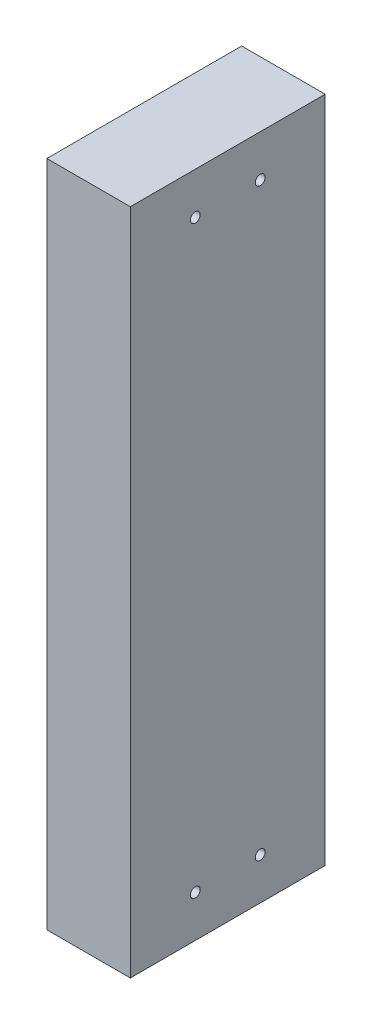
ISO-10303-21;
HEADER;
FILE_DESCRIPTION(('STEP AP214'),'2;1');
FILE_NAME('part.step','',(''),(''),'','','');
FILE_SCHEMA(('AUTOMOTIVE_DESIGN { 1 0 10303 214 1 1 1 1 }'));
ENDSEC;
DATA;
#1=APPLICATION_CONTEXT('core data for automotive mechanical design processes');
#2=APPLICATION_PROTOCOL_DEFINITION('international standard','automotive_design',2000,#1);
#3=PRODUCT_CONTEXT('',#1,'mechanical');
#4=PRODUCT('Part','Part','',(#3));
#5=PRODUCT_RELATED_PRODUCT_CATEGORY('part','',(#4));
#6=PRODUCT_DEFINITION_FORMATION('','',#4);
#7=PRODUCT_DEFINITION_CONTEXT('part definition',#1,'design');
#8=PRODUCT_DEFINITION('design','',#6,#7);
#9=PRODUCT_DEFINITION_SHAPE('','',#8);
#10=(LENGTH_UNIT() NAMED_UNIT(*) SI_UNIT(.MILLI.,.METRE.));
#11=(NAMED_UNIT(*) PLANE_ANGLE_UNIT() SI_UNIT($,.RADIAN.));
#12=(NAMED_UNIT(*) SI_UNIT($,.STERADIAN.) SOLID_ANGLE_UNIT());
#13=UNCERTAINTY_MEASURE_WITH_UNIT(LENGTH_MEASURE(1.E-05),#10,'distance_accuracy_value','');
#14=(GEOMETRIC_REPRESENTATION_CONTEXT(3) GLOBAL_UNCERTAINTY_ASSIGNED_CONTEXT((#13)) GLOBAL_UNIT_ASSIGNED_CONTEXT((#10,
#11,#12)) REPRESENTATION_CONTEXT('',''));
#15=CARTESIAN_POINT('',(0.,0.,0.));
#16=DIRECTION('',(0.,0.,1.));
#17=DIRECTION('',(1.,0.,0.));
#18=AXIS2_PLACEMENT_3D('',#15,#16,#17);
#19=CARTESIAN_POINT('',(0.,304.8,0.));
#20=DIRECTION('',(1.,0.,0.));
#21=DIRECTION('',(0.,0.,-1.));
#22=AXIS2_PLACEMENT_3D('',#19,#20,#21);
#23=PLANE('',#22);
#24=CARTESIAN_POINT('',(0.,285.75,-29.6333333333333));
#25=DIRECTION('',(1.,0.,0.));
#26=DIRECTION('',(0.,0.,-1.));
#27=AXIS2_PLACEMENT_3D('',#24,#25,#26);
#28=CIRCLE('',#27,2.24789999999999);
#29=CARTESIAN_POINT('',(0.,285.75,-31.8812333333333));
#30=VERTEX_POINT('',#29);
#31=EDGE_CURVE('E119',#30,#30,#28,.T.);
#32=ORIENTED_EDGE('',*,*,#31,.T.);
#33=EDGE_LOOP('',(#32));
#34=FACE_BOUND('',#33,.T.);
#35=CARTESIAN_POINT('',(0.,19.05,-29.6333333333333));
#36=DIRECTION('',(1.,0.,0.));
#37=DIRECTION('',(0.,0.,-1.));
#38=AXIS2_PLACEMENT_3D('',#35,#36,#37);
#39=CIRCLE('',#38,2.2479);
#40=CARTESIAN_POINT('',(0.,19.05,-31.8812333333333));
#41=VERTEX_POINT('',#40);
#42=EDGE_CURVE('E125',#41,#41,#39,.T.);
#43=ORIENTED_EDGE('',*,*,#42,.T.);
#44=EDGE_LOOP('',(#43));
#45=FACE_BOUND('',#44,.T.);
#46=CARTESIAN_POINT('',(0.,19.05,-59.2666666666667));
#47=DIRECTION('',(1.,0.,0.));
#48=DIRECTION('',(0.,0.,-1.));
#49=AXIS2_PLACEMENT_3D('',#46,#47,#48);
#50=CIRCLE('',#49,2.2479);
#51=CARTESIAN_POINT('',(0.,19.05,-61.5145666666667));
#52=VERTEX_POINT('',#51);
#53=EDGE_CURVE('E113',#52,#52,#50,.T.);
#54=ORIENTED_EDGE('',*,*,#53,.T.);
#55=EDGE_LOOP('',(#54));
#56=FACE_BOUND('',#55,.T.);
#57=CARTESIAN_POINT('',(0.,285.75,-59.2666666666667));
#58=DIRECTION('',(1.,0.,0.));
#59=DIRECTION('',(0.,0.,-1.));
#60=AXIS2_PLACEMENT_3D('',#57,#58,#59);
#61=CIRCLE('',#60,2.24789999999999);
#62=CARTESIAN_POINT('',(0.,285.75,-61.5145666666666));
#63=VERTEX_POINT('',#62);
#64=EDGE_CURVE('E99',#63,#63,#61,.T.);
#65=ORIENTED_EDGE('',*,*,#64,.T.);
#66=EDGE_LOOP('',(#65));
#67=FACE_BOUND('',#66,.T.);
#68=DIRECTION('',(0.,0.,1.));
#69=VECTOR('',#68,1.);
#70=CARTESIAN_POINT('',(0.,0.,0.));
#71=LINE('',#70,#69);
#72=CARTESIAN_POINT('',(0.,0.,-88.9));
#73=VERTEX_POINT('',#72);
#74=CARTESIAN_POINT('',(0.,0.,0.));
#75=VERTEX_POINT('',#74);
#76=EDGE_CURVE('E96',#73,#75,#71,.T.);
#77=ORIENTED_EDGE('',*,*,#76,.T.);
#78=DIRECTION('',(0.,-1.,0.));
#79=VECTOR('',#78,1.);
#80=CARTESIAN_POINT('',(0.,304.8,0.));
#81=LINE('',#80,#79);
#82=CARTESIAN_POINT('',(0.,304.8,0.));
#83=VERTEX_POINT('',#82);
#84=EDGE_CURVE('E11',#83,#75,#81,.T.);
#85=ORIENTED_EDGE('',*,*,#84,.F.);
#86=DIRECTION('',(0.,0.,1.));
#87=VECTOR('',#86,1.);
#88=CARTESIAN_POINT('',(0.,304.8,0.));
#89=LINE('',#88,#87);
#90=CARTESIAN_POINT('',(0.,304.8,-88.9));
#91=VERTEX_POINT('',#90);
#92=EDGE_CURVE('E84',#91,#83,#89,.T.);
#93=ORIENTED_EDGE('',*,*,#92,.F.);
#94=DIRECTION('',(0.,-1.,0.));
#95=VECTOR('',#94,1.);
#96=CARTESIAN_POINT('',(0.,304.8,-88.9));
#97=LINE('',#96,#95);
#98=EDGE_CURVE('E92',#91,#73,#97,.T.);
#99=ORIENTED_EDGE('',*,*,#98,.T.);
#100=EDGE_LOOP('',(#77,#85,#93,#99));
#101=FACE_BOUND('',#100,.T.);
#102=ADVANCED_FACE('F33',(#34,#45,#56,#67,#101),#23,.F.);
#103=CARTESIAN_POINT('',(0.,304.8,0.));
#104=DIRECTION('',(0.,0.,-1.));
#105=DIRECTION('',(-1.,0.,0.));
#106=AXIS2_PLACEMENT_3D('',#103,#104,#105);
#107=PLANE('',#106);
#108=DIRECTION('',(1.,0.,0.));
#109=VECTOR('',#108,1.);
#110=CARTESIAN_POINT('',(0.,0.,0.));
#111=LINE('',#110,#109);
#112=CARTESIAN_POINT('',(38.1,0.,0.));
#113=VERTEX_POINT('',#112);
#114=EDGE_CURVE('E88',#75,#113,#111,.T.);
#115=ORIENTED_EDGE('',*,*,#114,.T.);
#116=DIRECTION('',(0.,-1.,0.));
#117=VECTOR('',#116,1.);
#118=CARTESIAN_POINT('',(38.1,304.8,0.));
#119=LINE('',#118,#117);
#120=CARTESIAN_POINT('',(38.1,304.8,0.));
#121=VERTEX_POINT('',#120);
#122=EDGE_CURVE('E41',#121,#113,#119,.T.);
#123=ORIENTED_EDGE('',*,*,#122,.F.);
#124=DIRECTION('',(1.,0.,0.));
#125=VECTOR('',#124,1.);
#126=CARTESIAN_POINT('',(0.,304.8,0.));
#127=LINE('',#126,#125);
#128=EDGE_CURVE('E79',#83,#121,#127,.T.);
#129=ORIENTED_EDGE('',*,*,#128,.F.);
#130=ORIENTED_EDGE('',*,*,#84,.T.);
#131=EDGE_LOOP('',(#115,#123,#129,#130));
#132=FACE_BOUND('',#131,.T.);
#133=ADVANCED_FACE('F87',(#132),#107,.F.);
#134=CARTESIAN_POINT('',(38.1,304.8,0.));
#135=DIRECTION('',(-1.,0.,0.));
#136=DIRECTION('',(0.,0.,1.));
#137=AXIS2_PLACEMENT_3D('',#134,#135,#136);
#138=PLANE('',#137);
#139=CARTESIAN_POINT('',(38.1,285.75,-29.6333333333333));
#140=DIRECTION('',(1.,0.,0.));
#141=DIRECTION('',(0.,0.,-1.));
#142=AXIS2_PLACEMENT_3D('',#139,#140,#141);
#143=CIRCLE('',#142,2.24789999999999);
#144=CARTESIAN_POINT('',(38.1,285.75,-31.8812333333333));
#145=VERTEX_POINT('',#144);
#146=EDGE_CURVE('E116',#145,#145,#143,.T.);
#147=ORIENTED_EDGE('',*,*,#146,.F.);
#148=EDGE_LOOP('',(#147));
#149=FACE_BOUND('',#148,.T.);
#150=CARTESIAN_POINT('',(38.1,19.05,-29.6333333333333));
#151=DIRECTION('',(1.,0.,0.));
#152=DIRECTION('',(0.,0.,-1.));
#153=AXIS2_PLACEMENT_3D('',#150,#151,#152);
#154=CIRCLE('',#153,2.2479);
#155=CARTESIAN_POINT('',(38.1,19.05,-31.8812333333333));
#156=VERTEX_POINT('',#155);
#157=EDGE_CURVE('E122',#156,#156,#154,.T.);
#158=ORIENTED_EDGE('',*,*,#157,.F.);
#159=EDGE_LOOP('',(#158));
#160=FACE_BOUND('',#159,.T.);
#161=CARTESIAN_POINT('',(38.1,19.05,-59.2666666666667));
#162=DIRECTION('',(1.,0.,0.));
#163=DIRECTION('',(0.,0.,-1.));
#164=AXIS2_PLACEMENT_3D('',#161,#162,#163);
#165=CIRCLE('',#164,2.2479);
#166=CARTESIAN_POINT('',(38.1,19.05,-61.5145666666667));
#167=VERTEX_POINT('',#166);
#168=EDGE_CURVE('E128',#167,#167,#165,.T.);
#169=ORIENTED_EDGE('',*,*,#168,.F.);
#170=EDGE_LOOP('',(#169));
#171=FACE_BOUND('',#170,.T.);
#172=CARTESIAN_POINT('',(38.1,285.75,-59.2666666666667));
#173=DIRECTION('',(1.,0.,0.));
#174=DIRECTION('',(0.,0.,-1.));
#175=AXIS2_PLACEMENT_3D('',#172,#173,#174);
#176=CIRCLE('',#175,2.24789999999999);
#177=CARTESIAN_POINT('',(38.1,285.75,-61.5145666666666));
#178=VERTEX_POINT('',#177);
#179=EDGE_CURVE('E110',#178,#178,#176,.T.);
#180=ORIENTED_EDGE('',*,*,#179,.F.);
#181=EDGE_LOOP('',(#180));
#182=FACE_BOUND('',#181,.T.);
#183=DIRECTION('',(0.,0.,-1.));
#184=VECTOR('',#183,1.);
#185=CARTESIAN_POINT('',(38.1,0.,0.));
#186=LINE('',#185,#184);
#187=CARTESIAN_POINT('',(38.1,0.,-88.9));
#188=VERTEX_POINT('',#187);
#189=EDGE_CURVE('E66',#113,#188,#186,.T.);
#190=ORIENTED_EDGE('',*,*,#189,.T.);
#191=DIRECTION('',(0.,-1.,0.));
#192=VECTOR('',#191,1.);
#193=CARTESIAN_POINT('',(38.1,304.8,-88.9));
#194=LINE('',#193,#192);
#195=CARTESIAN_POINT('',(38.1,304.8,-88.9));
#196=VERTEX_POINT('',#195);
#197=EDGE_CURVE('E89',#196,#188,#194,.T.);
#198=ORIENTED_EDGE('',*,*,#197,.F.);
#199=DIRECTION('',(0.,0.,-1.));
#200=VECTOR('',#199,1.);
#201=CARTESIAN_POINT('',(38.1,304.8,0.));
#202=LINE('',#201,#200);
#203=EDGE_CURVE('E82',#121,#196,#202,.T.);
#204=ORIENTED_EDGE('',*,*,#203,.F.);
#205=ORIENTED_EDGE('',*,*,#122,.T.);
#206=EDGE_LOOP('',(#190,#198,#204,#205));
#207=FACE_BOUND('',#206,.T.);
#208=ADVANCED_FACE('F90',(#149,#160,#171,#182,#207),#138,.F.);
#209=CARTESIAN_POINT('',(0.,304.8,-88.9));
#210=DIRECTION('',(0.,0.,1.));
#211=DIRECTION('',(1.,0.,0.));
#212=AXIS2_PLACEMENT_3D('',#209,#210,#211);
#213=PLANE('',#212);
#214=DIRECTION('',(-1.,0.,0.));
#215=VECTOR('',#214,1.);
#216=CARTESIAN_POINT('',(0.,0.,-88.9));
#217=LINE('',#216,#215);
#218=EDGE_CURVE('E72',#188,#73,#217,.T.);
#219=ORIENTED_EDGE('',*,*,#218,.T.);
#220=ORIENTED_EDGE('',*,*,#98,.F.);
#221=DIRECTION('',(-1.,0.,0.));
#222=VECTOR('',#221,1.);
#223=CARTESIAN_POINT('',(0.,304.8,-88.9));
#224=LINE('',#223,#222);
#225=EDGE_CURVE('E49',#196,#91,#224,.T.);
#226=ORIENTED_EDGE('',*,*,#225,.F.);
#227=ORIENTED_EDGE('',*,*,#197,.T.);
#228=EDGE_LOOP('',(#219,#220,#226,#227));
#229=FACE_BOUND('',#228,.T.);
#230=ADVANCED_FACE('F104',(#229),#213,.F.);
#231=CARTESIAN_POINT('',(0.,304.8,0.));
#232=DIRECTION('',(0.,-1.,0.));
#233=DIRECTION('',(0.,0.,-1.));
#234=AXIS2_PLACEMENT_3D('',#231,#232,#233);
#235=PLANE('',#234);
#236=ORIENTED_EDGE('',*,*,#92,.T.);
#237=ORIENTED_EDGE('',*,*,#128,.T.);
#238=ORIENTED_EDGE('',*,*,#203,.T.);
#239=ORIENTED_EDGE('',*,*,#225,.T.);
#240=EDGE_LOOP('',(#236,#237,#238,#239));
#241=FACE_BOUND('',#240,.T.);
#242=ADVANCED_FACE('F80',(#241),#235,.F.);
#243=CARTESIAN_POINT('',(0.,0.,0.));
#244=DIRECTION('',(0.,-1.,0.));
#245=DIRECTION('',(0.,0.,-1.));
#246=AXIS2_PLACEMENT_3D('',#243,#244,#245);
#247=PLANE('',#246);
#248=ORIENTED_EDGE('',*,*,#76,.F.);
#249=ORIENTED_EDGE('',*,*,#218,.F.);
#250=ORIENTED_EDGE('',*,*,#189,.F.);
#251=ORIENTED_EDGE('',*,*,#114,.F.);
#252=EDGE_LOOP('',(#248,#249,#250,#251));
#253=FACE_BOUND('',#252,.T.);
#254=ADVANCED_FACE('F107',(#253),#247,.T.);
#255=CARTESIAN_POINT('',(0.,285.75,-59.2666666666667));
#256=DIRECTION('',(1.,0.,0.));
#257=DIRECTION('',(0.,0.,-1.));
#258=AXIS2_PLACEMENT_3D('',#255,#256,#257);
#259=CYLINDRICAL_SURFACE('',#258,2.24789999999999);
#260=CARTESIAN_POINT('',(0.,285.75,-61.5145666666666));
#261=CARTESIAN_POINT('',(0.396875,285.75,-61.5145666666666));
#262=CARTESIAN_POINT('',(0.79375,285.75,-61.5145666666666));
#263=CARTESIAN_POINT('',(1.5875,285.75,-61.5145666666666));
#264=CARTESIAN_POINT('',(1.984375,285.75,-61.5145666666666));
#265=CARTESIAN_POINT('',(2.778125,285.75,-61.5145666666666));
#266=CARTESIAN_POINT('',(3.175,285.75,-61.5145666666666));
#267=CARTESIAN_POINT('',(3.96875,285.75,-61.5145666666666));
#268=CARTESIAN_POINT('',(4.365625,285.75,-61.5145666666666));
#269=CARTESIAN_POINT('',(5.159375,285.75,-61.5145666666666));
#270=CARTESIAN_POINT('',(5.55625,285.75,-61.5145666666666));
#271=CARTESIAN_POINT('',(6.35,285.75,-61.5145666666666));
#272=CARTESIAN_POINT('',(6.746875,285.75,-61.5145666666666));
#273=CARTESIAN_POINT('',(7.540625,285.75,-61.5145666666666));
#274=CARTESIAN_POINT('',(7.9375,285.75,-61.5145666666666));
#275=CARTESIAN_POINT('',(8.73125,285.75,-61.5145666666666));
#276=CARTESIAN_POINT('',(9.128125,285.75,-61.5145666666666));
#277=CARTESIAN_POINT('',(9.921875,285.75,-61.5145666666666));
#278=CARTESIAN_POINT('',(10.31875,285.75,-61.5145666666666));
#279=CARTESIAN_POINT('',(11.1125,285.75,-61.5145666666666));
#280=CARTESIAN_POINT('',(11.509375,285.75,-61.5145666666666));
#281=CARTESIAN_POINT('',(12.303125,285.75,-61.5145666666666));
#282=CARTESIAN_POINT('',(12.7,285.75,-61.5145666666666));
#283=CARTESIAN_POINT('',(13.49375,285.75,-61.5145666666666));
#284=CARTESIAN_POINT('',(13.890625,285.75,-61.5145666666666));
#285=CARTESIAN_POINT('',(14.684375,285.75,-61.5145666666666));
#286=CARTESIAN_POINT('',(15.08125,285.75,-61.5145666666666));
#287=CARTESIAN_POINT('',(15.875,285.75,-61.5145666666666));
#288=CARTESIAN_POINT('',(16.271875,285.75,-61.5145666666666));
#289=CARTESIAN_POINT('',(17.065625,285.75,-61.5145666666666));
#290=CARTESIAN_POINT('',(17.4625,285.75,-61.5145666666666));
#291=CARTESIAN_POINT('',(18.25625,285.75,-61.5145666666666));
#292=CARTESIAN_POINT('',(18.653125,285.75,-61.5145666666666));
#293=CARTESIAN_POINT('',(19.446875,285.75,-61.5145666666666));
#294=CARTESIAN_POINT('',(19.84375,285.75,-61.5145666666666));
#295=CARTESIAN_POINT('',(20.6375,285.75,-61.5145666666666));
#296=CARTESIAN_POINT('',(21.034375,285.75,-61.5145666666666));
#297=CARTESIAN_POINT('',(21.828125,285.75,-61.5145666666666));
#298=CARTESIAN_POINT('',(22.225,285.75,-61.5145666666666));
#299=CARTESIAN_POINT('',(23.01875,285.75,-61.5145666666666));
#300=CARTESIAN_POINT('',(23.415625,285.75,-61.5145666666666));
#301=CARTESIAN_POINT('',(24.209375,285.75,-61.5145666666666));
#302=CARTESIAN_POINT('',(24.60625,285.75,-61.5145666666666));
#303=CARTESIAN_POINT('',(25.4,285.75,-61.5145666666666));
#304=CARTESIAN_POINT('',(25.796875,285.75,-61.5145666666666));
#305=CARTESIAN_POINT('',(26.590625,285.75,-61.5145666666666));
#306=CARTESIAN_POINT('',(26.9875,285.75,-61.5145666666666));
#307=CARTESIAN_POINT('',(27.78125,285.75,-61.5145666666666));
#308=CARTESIAN_POINT('',(28.178125,285.75,-61.5145666666666));
#309=CARTESIAN_POINT('',(28.971875,285.75,-61.5145666666666));
#310=CARTESIAN_POINT('',(29.36875,285.75,-61.5145666666666));
#311=CARTESIAN_POINT('',(30.1625,285.75,-61.5145666666666));
#312=CARTESIAN_POINT('',(30.559375,285.75,-61.5145666666666));
#313=CARTESIAN_POINT('',(31.353125,285.75,-61.5145666666666));
#314=CARTESIAN_POINT('',(31.75,285.75,-61.5145666666666));
#315=CARTESIAN_POINT('',(32.54375,285.75,-61.5145666666666));
#316=CARTESIAN_POINT('',(32.940625,285.75,-61.5145666666666));
#317=CARTESIAN_POINT('',(33.734375,285.75,-61.5145666666666));
#318=CARTESIAN_POINT('',(34.13125,285.75,-61.5145666666666));
#319=CARTESIAN_POINT('',(34.925,285.75,-61.5145666666666));
#320=CARTESIAN_POINT('',(35.321875,285.75,-61.5145666666666));
#321=CARTESIAN_POINT('',(36.115625,285.75,-61.5145666666666));
#322=CARTESIAN_POINT('',(36.5125,285.75,-61.5145666666666));
#323=CARTESIAN_POINT('',(37.30625,285.75,-61.5145666666666));
#324=CARTESIAN_POINT('',(37.703125,285.75,-61.5145666666666));
#325=CARTESIAN_POINT('',(38.1,285.75,-61.5145666666666));
#326=B_SPLINE_CURVE_WITH_KNOTS('',3,(#260,#261,#262,#263,#264,#265,#266,#267,#268,#269,#270,
#271,#272,#273,#274,#275,#276,#277,#278,#279,#280,#281,#282,#283,#284,#285,#286,#287,#288,#289,
#290,#291,#292,#293,#294,#295,#296,#297,#298,#299,#300,#301,#302,#303,#304,#305,#306,#307,#308,
#309,#310,#311,#312,#313,#314,#315,#316,#317,#318,#319,#320,#321,#322,#323,#324,#325),
.UNSPECIFIED.,.F.,.F.,(4,2,2,2,2,2,2,2,2,2,2,2,2,2,2,2,2,2,2,2,2,2,2,2,2,2,2,2,2,2,2,2,4),(0.,
1.190625,2.38125,3.571875,4.7625,5.953125,7.14375,8.334375,9.525,10.715625,11.90625,13.096875,
14.2875,15.478125,16.66875,17.859375,19.05,20.240625,21.43125,22.621875,23.8125,25.003125,
26.19375,27.384375,28.575,29.765625,30.95625,32.146875,33.3375,34.528125,35.71875,36.909375,
38.1),.UNSPECIFIED.);
#327=EDGE_CURVE('BSEAM140',#63,#178,#326,.T.);
#328=ORIENTED_EDGE('',*,*,#64,.F.);
#329=ORIENTED_EDGE('',*,*,#179,.T.);
#330=ORIENTED_EDGE('',*,*,#327,.T.);
#331=ORIENTED_EDGE('',*,*,#327,.F.);
#332=EDGE_LOOP('',(#328,#330,#329,#331));
#333=FACE_BOUND('',#332,.T.);
#334=ADVANCED_FACE('F140',(#333),#259,.F.);
#335=CARTESIAN_POINT('',(0.,19.05,-59.2666666666667));
#336=DIRECTION('',(1.,0.,0.));
#337=DIRECTION('',(0.,0.,-1.));
#338=AXIS2_PLACEMENT_3D('',#335,#336,#337);
#339=CYLINDRICAL_SURFACE('',#338,2.2479);
#340=CARTESIAN_POINT('',(0.,19.05,-61.5145666666667));
#341=CARTESIAN_POINT('',(0.396875,19.05,-61.5145666666667));
#342=CARTESIAN_POINT('',(0.79375,19.05,-61.5145666666667));
#343=CARTESIAN_POINT('',(1.5875,19.05,-61.5145666666667));
#344=CARTESIAN_POINT('',(1.984375,19.05,-61.5145666666667));
#345=CARTESIAN_POINT('',(2.778125,19.05,-61.5145666666667));
#346=CARTESIAN_POINT('',(3.175,19.05,-61.5145666666667));
#347=CARTESIAN_POINT('',(3.96875,19.05,-61.5145666666667));
#348=CARTESIAN_POINT('',(4.365625,19.05,-61.5145666666667));
#349=CARTESIAN_POINT('',(5.159375,19.05,-61.5145666666667));
#350=CARTESIAN_POINT('',(5.55625,19.05,-61.5145666666667));
#351=CARTESIAN_POINT('',(6.35,19.05,-61.5145666666667));
#352=CARTESIAN_POINT('',(6.746875,19.05,-61.5145666666667));
#353=CARTESIAN_POINT('',(7.540625,19.05,-61.5145666666667));
#354=CARTESIAN_POINT('',(7.9375,19.05,-61.5145666666667));
#355=CARTESIAN_POINT('',(8.73125,19.05,-61.5145666666667));
#356=CARTESIAN_POINT('',(9.128125,19.05,-61.5145666666667));
#357=CARTESIAN_POINT('',(9.921875,19.05,-61.5145666666667));
#358=CARTESIAN_POINT('',(10.31875,19.05,-61.5145666666667));
#359=CARTESIAN_POINT('',(11.1125,19.05,-61.5145666666667));
#360=CARTESIAN_POINT('',(11.509375,19.05,-61.5145666666667));
#361=CARTESIAN_POINT('',(12.303125,19.05,-61.5145666666667));
#362=CARTESIAN_POINT('',(12.7,19.05,-61.5145666666667));
#363=CARTESIAN_POINT('',(13.49375,19.05,-61.5145666666667));
#364=CARTESIAN_POINT('',(13.890625,19.05,-61.5145666666667));
#365=CARTESIAN_POINT('',(14.684375,19.05,-61.5145666666667));
#366=CARTESIAN_POINT('',(15.08125,19.05,-61.5145666666667));
#367=CARTESIAN_POINT('',(15.875,19.05,-61.5145666666667));
#368=CARTESIAN_POINT('',(16.271875,19.05,-61.5145666666667));
#369=CARTESIAN_POINT('',(17.065625,19.05,-61.5145666666667));
#370=CARTESIAN_POINT('',(17.4625,19.05,-61.5145666666667));
#371=CARTESIAN_POINT('',(18.25625,19.05,-61.5145666666667));
#372=CARTESIAN_POINT('',(18.653125,19.05,-61.5145666666667));
#373=CARTESIAN_POINT('',(19.446875,19.05,-61.5145666666667));
#374=CARTESIAN_POINT('',(19.84375,19.05,-61.5145666666667));
#375=CARTESIAN_POINT('',(20.6375,19.05,-61.5145666666667));
#376=CARTESIAN_POINT('',(21.034375,19.05,-61.5145666666667));
#377=CARTESIAN_POINT('',(21.828125,19.05,-61.5145666666667));
#378=CARTESIAN_POINT('',(22.225,19.05,-61.5145666666667));
#379=CARTESIAN_POINT('',(23.01875,19.05,-61.5145666666667));
#380=CARTESIAN_POINT('',(23.415625,19.05,-61.5145666666667));
#381=CARTESIAN_POINT('',(24.209375,19.05,-61.5145666666667));
#382=CARTESIAN_POINT('',(24.60625,19.05,-61.5145666666667));
#383=CARTESIAN_POINT('',(25.4,19.05,-61.5145666666667));
#384=CARTESIAN_POINT('',(25.796875,19.05,-61.5145666666667));
#385=CARTESIAN_POINT('',(26.590625,19.05,-61.5145666666667));
#386=CARTESIAN_POINT('',(26.9875,19.05,-61.5145666666667));
#387=CARTESIAN_POINT('',(27.78125,19.05,-61.5145666666667));
#388=CARTESIAN_POINT('',(28.178125,19.05,-61.5145666666667));
#389=CARTESIAN_POINT('',(28.971875,19.05,-61.5145666666667));
#390=CARTESIAN_POINT('',(29.36875,19.05,-61.5145666666667));
#391=CARTESIAN_POINT('',(30.1625,19.05,-61.5145666666667));
#392=CARTESIAN_POINT('',(30.559375,19.05,-61.5145666666667));
#393=CARTESIAN_POINT('',(31.353125,19.05,-61.5145666666667));
#394=CARTESIAN_POINT('',(31.75,19.05,-61.5145666666667));
#395=CARTESIAN_POINT('',(32.54375,19.05,-61.5145666666667));
#396=CARTESIAN_POINT('',(32.940625,19.05,-61.5145666666667));
#397=CARTESIAN_POINT('',(33.734375,19.05,-61.5145666666667));
#398=CARTESIAN_POINT('',(34.13125,19.05,-61.5145666666667));
#399=CARTESIAN_POINT('',(34.925,19.05,-61.5145666666667));
#400=CARTESIAN_POINT('',(35.321875,19.05,-61.5145666666667));
#401=CARTESIAN_POINT('',(36.115625,19.05,-61.5145666666667));
#402=CARTESIAN_POINT('',(36.5125,19.05,-61.5145666666667));
#403=CARTESIAN_POINT('',(37.30625,19.05,-61.5145666666667));
#404=CARTESIAN_POINT('',(37.703125,19.05,-61.5145666666667));
#405=CARTESIAN_POINT('',(38.1,19.05,-61.5145666666667));
#406=B_SPLINE_CURVE_WITH_KNOTS('',3,(#340,#341,#342,#343,#344,#345,#346,#347,#348,#349,#350,
#351,#352,#353,#354,#355,#356,#357,#358,#359,#360,#361,#362,#363,#364,#365,#366,#367,#368,#369,
#370,#371,#372,#373,#374,#375,#376,#377,#378,#379,#380,#381,#382,#383,#384,#385,#386,#387,#388,
#389,#390,#391,#392,#393,#394,#395,#396,#397,#398,#399,#400,#401,#402,#403,#404,#405),
.UNSPECIFIED.,.F.,.F.,(4,2,2,2,2,2,2,2,2,2,2,2,2,2,2,2,2,2,2,2,2,2,2,2,2,2,2,2,2,2,2,2,4),(0.,
1.190625,2.38125,3.571875,4.7625,5.953125,7.14375,8.334375,9.525,10.715625,11.90625,13.096875,
14.2875,15.478125,16.66875,17.859375,19.05,20.240625,21.43125,22.621875,23.8125,25.003125,
26.19375,27.384375,28.575,29.765625,30.95625,32.146875,33.3375,34.528125,35.71875,36.909375,
38.1),.UNSPECIFIED.);
#407=EDGE_CURVE('BSEAM136',#52,#167,#406,.T.);
#408=ORIENTED_EDGE('',*,*,#53,.F.);
#409=ORIENTED_EDGE('',*,*,#168,.T.);
#410=ORIENTED_EDGE('',*,*,#407,.T.);
#411=ORIENTED_EDGE('',*,*,#407,.F.);
#412=EDGE_LOOP('',(#408,#410,#409,#411));
#413=FACE_BOUND('',#412,.T.);
#414=ADVANCED_FACE('F136',(#413),#339,.F.);
#415=CARTESIAN_POINT('',(0.,19.05,-29.6333333333333));
#416=DIRECTION('',(1.,0.,0.));
#417=DIRECTION('',(0.,0.,-1.));
#418=AXIS2_PLACEMENT_3D('',#415,#416,#417);
#419=CYLINDRICAL_SURFACE('',#418,2.2479);
#420=CARTESIAN_POINT('',(0.,19.05,-31.8812333333333));
#421=CARTESIAN_POINT('',(0.396875,19.05,-31.8812333333333));
#422=CARTESIAN_POINT('',(0.79375,19.05,-31.8812333333333));
#423=CARTESIAN_POINT('',(1.5875,19.05,-31.8812333333333));
#424=CARTESIAN_POINT('',(1.984375,19.05,-31.8812333333333));
#425=CARTESIAN_POINT('',(2.778125,19.05,-31.8812333333333));
#426=CARTESIAN_POINT('',(3.175,19.05,-31.8812333333333));
#427=CARTESIAN_POINT('',(3.96875,19.05,-31.8812333333333));
#428=CARTESIAN_POINT('',(4.365625,19.05,-31.8812333333333));
#429=CARTESIAN_POINT('',(5.159375,19.05,-31.8812333333333));
#430=CARTESIAN_POINT('',(5.55625,19.05,-31.8812333333333));
#431=CARTESIAN_POINT('',(6.35,19.05,-31.8812333333333));
#432=CARTESIAN_POINT('',(6.746875,19.05,-31.8812333333333));
#433=CARTESIAN_POINT('',(7.540625,19.05,-31.8812333333333));
#434=CARTESIAN_POINT('',(7.9375,19.05,-31.8812333333333));
#435=CARTESIAN_POINT('',(8.73125,19.05,-31.8812333333333));
#436=CARTESIAN_POINT('',(9.128125,19.05,-31.8812333333333));
#437=CARTESIAN_POINT('',(9.921875,19.05,-31.8812333333333));
#438=CARTESIAN_POINT('',(10.31875,19.05,-31.8812333333333));
#439=CARTESIAN_POINT('',(11.1125,19.05,-31.8812333333333));
#440=CARTESIAN_POINT('',(11.509375,19.05,-31.8812333333333));
#441=CARTESIAN_POINT('',(12.303125,19.05,-31.8812333333333));
#442=CARTESIAN_POINT('',(12.7,19.05,-31.8812333333333));
#443=CARTESIAN_POINT('',(13.49375,19.05,-31.8812333333333));
#444=CARTESIAN_POINT('',(13.890625,19.05,-31.8812333333333));
#445=CARTESIAN_POINT('',(14.684375,19.05,-31.8812333333333));
#446=CARTESIAN_POINT('',(15.08125,19.05,-31.8812333333333));
#447=CARTESIAN_POINT('',(15.875,19.05,-31.8812333333333));
#448=CARTESIAN_POINT('',(16.271875,19.05,-31.8812333333333));
#449=CARTESIAN_POINT('',(17.065625,19.05,-31.8812333333333));
#450=CARTESIAN_POINT('',(17.4625,19.05,-31.8812333333333));
#451=CARTESIAN_POINT('',(18.25625,19.05,-31.8812333333333));
#452=CARTESIAN_POINT('',(18.653125,19.05,-31.8812333333333));
#453=CARTESIAN_POINT('',(19.446875,19.05,-31.8812333333333));
#454=CARTESIAN_POINT('',(19.84375,19.05,-31.8812333333333));
#455=CARTESIAN_POINT('',(20.6375,19.05,-31.8812333333333));
#456=CARTESIAN_POINT('',(21.034375,19.05,-31.8812333333333));
#457=CARTESIAN_POINT('',(21.828125,19.05,-31.8812333333333));
#458=CARTESIAN_POINT('',(22.225,19.05,-31.8812333333333));
#459=CARTESIAN_POINT('',(23.01875,19.05,-31.8812333333333));
#460=CARTESIAN_POINT('',(23.415625,19.05,-31.8812333333333));
#461=CARTESIAN_POINT('',(24.209375,19.05,-31.8812333333333));
#462=CARTESIAN_POINT('',(24.60625,19.05,-31.8812333333333));
#463=CARTESIAN_POINT('',(25.4,19.05,-31.8812333333333));
#464=CARTESIAN_POINT('',(25.796875,19.05,-31.8812333333333));
#465=CARTESIAN_POINT('',(26.590625,19.05,-31.8812333333333));
#466=CARTESIAN_POINT('',(26.9875,19.05,-31.8812333333333));
#467=CARTESIAN_POINT('',(27.78125,19.05,-31.8812333333333));
#468=CARTESIAN_POINT('',(28.178125,19.05,-31.8812333333333));
#469=CARTESIAN_POINT('',(28.971875,19.05,-31.8812333333333));
#470=CARTESIAN_POINT('',(29.36875,19.05,-31.8812333333333));
#471=CARTESIAN_POINT('',(30.1625,19.05,-31.8812333333333));
#472=CARTESIAN_POINT('',(30.559375,19.05,-31.8812333333333));
#473=CARTESIAN_POINT('',(31.353125,19.05,-31.8812333333333));
#474=CARTESIAN_POINT('',(31.75,19.05,-31.8812333333333));
#475=CARTESIAN_POINT('',(32.54375,19.05,-31.8812333333333));
#476=CARTESIAN_POINT('',(32.940625,19.05,-31.8812333333333));
#477=CARTESIAN_POINT('',(33.734375,19.05,-31.8812333333333));
#478=CARTESIAN_POINT('',(34.13125,19.05,-31.8812333333333));
#479=CARTESIAN_POINT('',(34.925,19.05,-31.8812333333333));
#480=CARTESIAN_POINT('',(35.321875,19.05,-31.8812333333333));
#481=CARTESIAN_POINT('',(36.115625,19.05,-31.8812333333333));
#482=CARTESIAN_POINT('',(36.5125,19.05,-31.8812333333333));
#483=CARTESIAN_POINT('',(37.30625,19.05,-31.8812333333333));
#484=CARTESIAN_POINT('',(37.703125,19.05,-31.8812333333333));
#485=CARTESIAN_POINT('',(38.1,19.05,-31.8812333333333));
#486=B_SPLINE_CURVE_WITH_KNOTS('',3,(#420,#421,#422,#423,#424,#425,#426,#427,#428,#429,#430,
#431,#432,#433,#434,#435,#436,#437,#438,#439,#440,#441,#442,#443,#444,#445,#446,#447,#448,#449,
#450,#451,#452,#453,#454,#455,#456,#457,#458,#459,#460,#461,#462,#463,#464,#465,#466,#467,#468,
#469,#470,#471,#472,#473,#474,#475,#476,#477,#478,#479,#480,#481,#482,#483,#484,#485),
.UNSPECIFIED.,.F.,.F.,(4,2,2,2,2,2,2,2,2,2,2,2,2,2,2,2,2,2,2,2,2,2,2,2,2,2,2,2,2,2,2,2,4),(0.,
1.190625,2.38125,3.571875,4.7625,5.953125,7.14375,8.334375,9.525,10.715625,11.90625,13.096875,
14.2875,15.478125,16.66875,17.859375,19.05,20.240625,21.43125,22.621875,23.8125,25.003125,
26.19375,27.384375,28.575,29.765625,30.95625,32.146875,33.3375,34.528125,35.71875,36.909375,
38.1),.UNSPECIFIED.);
#487=EDGE_CURVE('BSEAM139',#41,#156,#486,.T.);
#488=ORIENTED_EDGE('',*,*,#42,.F.);
#489=ORIENTED_EDGE('',*,*,#157,.T.);
#490=ORIENTED_EDGE('',*,*,#487,.T.);
#491=ORIENTED_EDGE('',*,*,#487,.F.);
#492=EDGE_LOOP('',(#488,#490,#489,#491));
#493=FACE_BOUND('',#492,.T.);
#494=ADVANCED_FACE('F139',(#493),#419,.F.);
#495=CARTESIAN_POINT('',(0.,285.75,-29.6333333333333));
#496=DIRECTION('',(1.,0.,0.));
#497=DIRECTION('',(0.,0.,-1.));
#498=AXIS2_PLACEMENT_3D('',#495,#496,#497);
#499=CYLINDRICAL_SURFACE('',#498,2.24789999999999);
#500=CARTESIAN_POINT('',(0.,285.75,-31.8812333333333));
#501=CARTESIAN_POINT('',(0.396875,285.75,-31.8812333333333));
#502=CARTESIAN_POINT('',(0.79375,285.75,-31.8812333333333));
#503=CARTESIAN_POINT('',(1.5875,285.75,-31.8812333333333));
#504=CARTESIAN_POINT('',(1.984375,285.75,-31.8812333333333));
#505=CARTESIAN_POINT('',(2.778125,285.75,-31.8812333333333));
#506=CARTESIAN_POINT('',(3.175,285.75,-31.8812333333333));
#507=CARTESIAN_POINT('',(3.96875,285.75,-31.8812333333333));
#508=CARTESIAN_POINT('',(4.365625,285.75,-31.8812333333333));
#509=CARTESIAN_POINT('',(5.159375,285.75,-31.8812333333333));
#510=CARTESIAN_POINT('',(5.55625,285.75,-31.8812333333333));
#511=CARTESIAN_POINT('',(6.35,285.75,-31.8812333333333));
#512=CARTESIAN_POINT('',(6.746875,285.75,-31.8812333333333));
#513=CARTESIAN_POINT('',(7.540625,285.75,-31.8812333333333));
#514=CARTESIAN_POINT('',(7.9375,285.75,-31.8812333333333));
#515=CARTESIAN_POINT('',(8.73125,285.75,-31.8812333333333));
#516=CARTESIAN_POINT('',(9.128125,285.75,-31.8812333333333));
#517=CARTESIAN_POINT('',(9.921875,285.75,-31.8812333333333));
#518=CARTESIAN_POINT('',(10.31875,285.75,-31.8812333333333));
#519=CARTESIAN_POINT('',(11.1125,285.75,-31.8812333333333));
#520=CARTESIAN_POINT('',(11.509375,285.75,-31.8812333333333));
#521=CARTESIAN_POINT('',(12.303125,285.75,-31.8812333333333));
#522=CARTESIAN_POINT('',(12.7,285.75,-31.8812333333333));
#523=CARTESIAN_POINT('',(13.49375,285.75,-31.8812333333333));
#524=CARTESIAN_POINT('',(13.890625,285.75,-31.8812333333333));
#525=CARTESIAN_POINT('',(14.684375,285.75,-31.8812333333333));
#526=CARTESIAN_POINT('',(15.08125,285.75,-31.8812333333333));
#527=CARTESIAN_POINT('',(15.875,285.75,-31.8812333333333));
#528=CARTESIAN_POINT('',(16.271875,285.75,-31.8812333333333));
#529=CARTESIAN_POINT('',(17.065625,285.75,-31.8812333333333));
#530=CARTESIAN_POINT('',(17.4625,285.75,-31.8812333333333));
#531=CARTESIAN_POINT('',(18.25625,285.75,-31.8812333333333));
#532=CARTESIAN_POINT('',(18.653125,285.75,-31.8812333333333));
#533=CARTESIAN_POINT('',(19.446875,285.75,-31.8812333333333));
#534=CARTESIAN_POINT('',(19.84375,285.75,-31.8812333333333));
#535=CARTESIAN_POINT('',(20.6375,285.75,-31.8812333333333));
#536=CARTESIAN_POINT('',(21.034375,285.75,-31.8812333333333));
#537=CARTESIAN_POINT('',(21.828125,285.75,-31.8812333333333));
#538=CARTESIAN_POINT('',(22.225,285.75,-31.8812333333333));
#539=CARTESIAN_POINT('',(23.01875,285.75,-31.8812333333333));
#540=CARTESIAN_POINT('',(23.415625,285.75,-31.8812333333333));
#541=CARTESIAN_POINT('',(24.209375,285.75,-31.8812333333333));
#542=CARTESIAN_POINT('',(24.60625,285.75,-31.8812333333333));
#543=CARTESIAN_POINT('',(25.4,285.75,-31.8812333333333));
#544=CARTESIAN_POINT('',(25.796875,285.75,-31.8812333333333));
#545=CARTESIAN_POINT('',(26.590625,285.75,-31.8812333333333));
#546=CARTESIAN_POINT('',(26.9875,285.75,-31.8812333333333));
#547=CARTESIAN_POINT('',(27.78125,285.75,-31.8812333333333));
#548=CARTESIAN_POINT('',(28.178125,285.75,-31.8812333333333));
#549=CARTESIAN_POINT('',(28.971875,285.75,-31.8812333333333));
#550=CARTESIAN_POINT('',(29.36875,285.75,-31.8812333333333));
#551=CARTESIAN_POINT('',(30.1625,285.75,-31.8812333333333));
#552=CARTESIAN_POINT('',(30.559375,285.75,-31.8812333333333));
#553=CARTESIAN_POINT('',(31.353125,285.75,-31.8812333333333));
#554=CARTESIAN_POINT('',(31.75,285.75,-31.8812333333333));
#555=CARTESIAN_POINT('',(32.54375,285.75,-31.8812333333333));
#556=CARTESIAN_POINT('',(32.940625,285.75,-31.8812333333333));
#557=CARTESIAN_POINT('',(33.734375,285.75,-31.8812333333333));
#558=CARTESIAN_POINT('',(34.13125,285.75,-31.8812333333333));
#559=CARTESIAN_POINT('',(34.925,285.75,-31.8812333333333));
#560=CARTESIAN_POINT('',(35.321875,285.75,-31.8812333333333));
#561=CARTESIAN_POINT('',(36.115625,285.75,-31.8812333333333));
#562=CARTESIAN_POINT('',(36.5125,285.75,-31.8812333333333));
#563=CARTESIAN_POINT('',(37.30625,285.75,-31.8812333333333));
#564=CARTESIAN_POINT('',(37.703125,285.75,-31.8812333333333));
#565=CARTESIAN_POINT('',(38.1,285.75,-31.8812333333333));
#566=B_SPLINE_CURVE_WITH_KNOTS('',3,(#500,#501,#502,#503,#504,#505,#506,#507,#508,#509,#510,
#511,#512,#513,#514,#515,#516,#517,#518,#519,#520,#521,#522,#523,#524,#525,#526,#527,#528,#529,
#530,#531,#532,#533,#534,#535,#536,#537,#538,#539,#540,#541,#542,#543,#544,#545,#546,#547,#548,
#549,#550,#551,#552,#553,#554,#555,#556,#557,#558,#559,#560,#561,#562,#563,#564,#565),
.UNSPECIFIED.,.F.,.F.,(4,2,2,2,2,2,2,2,2,2,2,2,2,2,2,2,2,2,2,2,2,2,2,2,2,2,2,2,2,2,2,2,4),(0.,
1.190625,2.38125,3.571875,4.7625,5.953125,7.14375,8.334375,9.525,10.715625,11.90625,13.096875,
14.2875,15.478125,16.66875,17.859375,19.05,20.240625,21.43125,22.621875,23.8125,25.003125,
26.19375,27.384375,28.575,29.765625,30.95625,32.146875,33.3375,34.528125,35.71875,36.909375,
38.1),.UNSPECIFIED.);
#567=EDGE_CURVE('BSEAM172',#30,#145,#566,.T.);
#568=ORIENTED_EDGE('',*,*,#31,.F.);
#569=ORIENTED_EDGE('',*,*,#146,.T.);
#570=ORIENTED_EDGE('',*,*,#567,.T.);
#571=ORIENTED_EDGE('',*,*,#567,.F.);
#572=EDGE_LOOP('',(#568,#570,#569,#571));
#573=FACE_BOUND('',#572,.T.);
#574=ADVANCED_FACE('F172',(#573),#499,.F.);
#575=CLOSED_SHELL('',(#102,#133,#208,#230,#242,#254,#334,#414,#494,#574));
#576=MANIFOLD_SOLID_BREP('B2',#575);
#577=ADVANCED_BREP_SHAPE_REPRESENTATION('',(#18,#576),#14);
#578=SHAPE_DEFINITION_REPRESENTATION(#9,#577);
ENDSEC;
END-ISO-10303-21;
